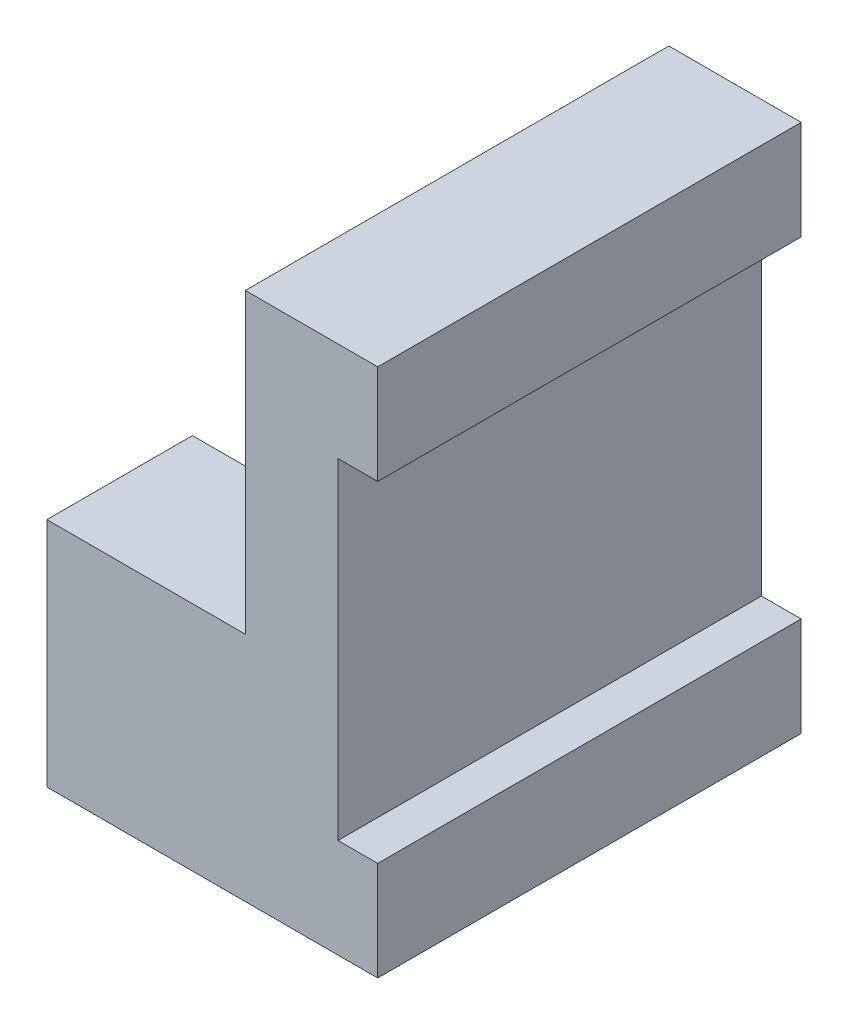
ISO-10303-21;
HEADER;
FILE_DESCRIPTION(('STEP AP214'),'2;1');
FILE_NAME('part.step','',(''),(''),'','','');
FILE_SCHEMA(('AUTOMOTIVE_DESIGN { 1 0 10303 214 1 1 1 1 }'));
ENDSEC;
DATA;
#1=APPLICATION_CONTEXT('core data for automotive mechanical design processes');
#2=APPLICATION_PROTOCOL_DEFINITION('international standard','automotive_design',2000,#1);
#3=PRODUCT_CONTEXT('',#1,'mechanical');
#4=PRODUCT('Part','Part','',(#3));
#5=PRODUCT_RELATED_PRODUCT_CATEGORY('part','',(#4));
#6=PRODUCT_DEFINITION_FORMATION('','',#4);
#7=PRODUCT_DEFINITION_CONTEXT('part definition',#1,'design');
#8=PRODUCT_DEFINITION('design','',#6,#7);
#9=PRODUCT_DEFINITION_SHAPE('','',#8);
#10=(LENGTH_UNIT() NAMED_UNIT(*) SI_UNIT(.MILLI.,.METRE.));
#11=(NAMED_UNIT(*) PLANE_ANGLE_UNIT() SI_UNIT($,.RADIAN.));
#12=(NAMED_UNIT(*) SI_UNIT($,.STERADIAN.) SOLID_ANGLE_UNIT());
#13=UNCERTAINTY_MEASURE_WITH_UNIT(LENGTH_MEASURE(1.E-05),#10,'distance_accuracy_value','');
#14=(GEOMETRIC_REPRESENTATION_CONTEXT(3) GLOBAL_UNCERTAINTY_ASSIGNED_CONTEXT((#13)) GLOBAL_UNIT_ASSIGNED_CONTEXT((#10,
#11,#12)) REPRESENTATION_CONTEXT('',''));
#15=CARTESIAN_POINT('',(0.,0.,0.));
#16=DIRECTION('',(0.,0.,1.));
#17=DIRECTION('',(1.,0.,0.));
#18=AXIS2_PLACEMENT_3D('',#15,#16,#17);
#19=CARTESIAN_POINT('',(0.,0.,64.));
#20=DIRECTION('',(1.,0.,0.));
#21=DIRECTION('',(0.,0.,-1.));
#22=AXIS2_PLACEMENT_3D('',#19,#20,#21);
#23=PLANE('',#22);
#24=DIRECTION('',(0.,0.,-1.));
#25=VECTOR('',#24,1.);
#26=CARTESIAN_POINT('',(0.,0.,64.));
#27=LINE('',#26,#25);
#28=CARTESIAN_POINT('',(0.,0.,22.));
#29=VERTEX_POINT('',#28);
#30=CARTESIAN_POINT('',(0.,0.,0.));
#31=VERTEX_POINT('',#30);
#32=EDGE_CURVE('E48',#29,#31,#27,.T.);
#33=ORIENTED_EDGE('',*,*,#32,.F.);
#34=DIRECTION('',(0.,-1.,0.));
#35=VECTOR('',#34,1.);
#36=CARTESIAN_POINT('',(0.,0.,22.));
#37=LINE('',#36,#35);
#38=CARTESIAN_POINT('',(0.,35.,22.));
#39=VERTEX_POINT('',#38);
#40=EDGE_CURVE('E328',#39,#29,#37,.T.);
#41=ORIENTED_EDGE('',*,*,#40,.F.);
#42=DIRECTION('',(0.,0.,-1.));
#43=VECTOR('',#42,1.);
#44=CARTESIAN_POINT('',(0.,35.,64.));
#45=LINE('',#44,#43);
#46=CARTESIAN_POINT('',(0.,35.,0.));
#47=VERTEX_POINT('',#46);
#48=EDGE_CURVE('E104',#39,#47,#45,.T.);
#49=ORIENTED_EDGE('',*,*,#48,.T.);
#50=DIRECTION('',(0.,-1.,0.));
#51=VECTOR('',#50,1.);
#52=CARTESIAN_POINT('',(0.,0.,0.));
#53=LINE('',#52,#51);
#54=EDGE_CURVE('E166',#47,#31,#53,.T.);
#55=ORIENTED_EDGE('',*,*,#54,.T.);
#56=EDGE_LOOP('',(#33,#41,#49,#55));
#57=FACE_BOUND('',#56,.T.);
#58=ADVANCED_FACE('F39',(#57),#23,.F.);
#59=CARTESIAN_POINT('',(0.,35.,64.));
#60=VERTEX_POINT('',#59);
#61=CARTESIAN_POINT('',(0.,35.,42.));
#62=VERTEX_POINT('',#61);
#63=EDGE_CURVE('E197',#60,#62,#45,.T.);
#64=ORIENTED_EDGE('',*,*,#63,.T.);
#65=DIRECTION('',(0.,1.,0.));
#66=VECTOR('',#65,1.);
#67=CARTESIAN_POINT('',(0.,0.,42.));
#68=LINE('',#67,#66);
#69=CARTESIAN_POINT('',(0.,0.,42.));
#70=VERTEX_POINT('',#69);
#71=EDGE_CURVE('E255',#70,#62,#68,.T.);
#72=ORIENTED_EDGE('',*,*,#71,.F.);
#73=CARTESIAN_POINT('',(0.,0.,64.));
#74=VERTEX_POINT('',#73);
#75=EDGE_CURVE('E11',#74,#70,#27,.T.);
#76=ORIENTED_EDGE('',*,*,#75,.F.);
#77=DIRECTION('',(0.,-1.,0.));
#78=VECTOR('',#77,1.);
#79=CARTESIAN_POINT('',(0.,0.,64.));
#80=LINE('',#79,#78);
#81=EDGE_CURVE('E196',#60,#74,#80,.T.);
#82=ORIENTED_EDGE('',*,*,#81,.F.);
#83=EDGE_LOOP('',(#64,#72,#76,#82));
#84=FACE_BOUND('',#83,.T.);
#85=ADVANCED_FACE('F41',(#84),#23,.F.);
#86=CARTESIAN_POINT('',(0.,0.,64.));
#87=DIRECTION('',(0.,1.,0.));
#88=DIRECTION('',(0.,0.,1.));
#89=AXIS2_PLACEMENT_3D('',#86,#87,#88);
#90=PLANE('',#89);
#91=DIRECTION('',(0.,0.,1.));
#92=VECTOR('',#91,1.);
#93=CARTESIAN_POINT('',(22.,0.,22.));
#94=LINE('',#93,#92);
#95=CARTESIAN_POINT('',(22.,0.,22.));
#96=VERTEX_POINT('',#95);
#97=CARTESIAN_POINT('',(22.,0.,42.));
#98=VERTEX_POINT('',#97);
#99=EDGE_CURVE('E317',#96,#98,#94,.T.);
#100=ORIENTED_EDGE('',*,*,#99,.F.);
#101=DIRECTION('',(-1.,0.,0.));
#102=VECTOR('',#101,1.);
#103=CARTESIAN_POINT('',(22.,0.,22.));
#104=LINE('',#103,#102);
#105=EDGE_CURVE('E234',#96,#29,#104,.T.);
#106=ORIENTED_EDGE('',*,*,#105,.T.);
#107=ORIENTED_EDGE('',*,*,#32,.T.);
#108=DIRECTION('',(1.,0.,0.));
#109=VECTOR('',#108,1.);
#110=CARTESIAN_POINT('',(0.,0.,0.));
#111=LINE('',#110,#109);
#112=CARTESIAN_POINT('',(50.,0.,0.));
#113=VERTEX_POINT('',#112);
#114=EDGE_CURVE('E169',#31,#113,#111,.T.);
#115=ORIENTED_EDGE('',*,*,#114,.T.);
#116=DIRECTION('',(0.,0.,-1.));
#117=VECTOR('',#116,1.);
#118=CARTESIAN_POINT('',(50.,0.,64.));
#119=LINE('',#118,#117);
#120=CARTESIAN_POINT('',(50.,0.,64.));
#121=VERTEX_POINT('',#120);
#122=EDGE_CURVE('E220',#121,#113,#119,.T.);
#123=ORIENTED_EDGE('',*,*,#122,.F.);
#124=DIRECTION('',(1.,0.,0.));
#125=VECTOR('',#124,1.);
#126=CARTESIAN_POINT('',(0.,0.,64.));
#127=LINE('',#126,#125);
#128=EDGE_CURVE('E112',#74,#121,#127,.T.);
#129=ORIENTED_EDGE('',*,*,#128,.F.);
#130=ORIENTED_EDGE('',*,*,#75,.T.);
#131=DIRECTION('',(-1.,0.,0.));
#132=VECTOR('',#131,1.);
#133=CARTESIAN_POINT('',(22.,0.,42.));
#134=LINE('',#133,#132);
#135=EDGE_CURVE('E265',#98,#70,#134,.T.);
#136=ORIENTED_EDGE('',*,*,#135,.F.);
#137=EDGE_LOOP('',(#100,#106,#107,#115,#123,#129,#130,#136));
#138=FACE_BOUND('',#137,.T.);
#139=ADVANCED_FACE('F231',(#138),#90,.F.);
#140=CARTESIAN_POINT('',(50.,15.,64.));
#141=DIRECTION('',(-1.,0.,0.));
#142=DIRECTION('',(0.,0.,1.));
#143=AXIS2_PLACEMENT_3D('',#140,#141,#142);
#144=PLANE('',#143);
#145=DIRECTION('',(0.,1.,0.));
#146=VECTOR('',#145,1.);
#147=CARTESIAN_POINT('',(50.,15.,0.));
#148=LINE('',#147,#146);
#149=CARTESIAN_POINT('',(50.,15.,0.));
#150=VERTEX_POINT('',#149);
#151=EDGE_CURVE('E173',#113,#150,#148,.T.);
#152=ORIENTED_EDGE('',*,*,#151,.T.);
#153=DIRECTION('',(0.,0.,-1.));
#154=VECTOR('',#153,1.);
#155=CARTESIAN_POINT('',(50.,15.,64.));
#156=LINE('',#155,#154);
#157=CARTESIAN_POINT('',(50.,15.,64.));
#158=VERTEX_POINT('',#157);
#159=EDGE_CURVE('E217',#158,#150,#156,.T.);
#160=ORIENTED_EDGE('',*,*,#159,.F.);
#161=DIRECTION('',(0.,1.,0.));
#162=VECTOR('',#161,1.);
#163=CARTESIAN_POINT('',(50.,15.,64.));
#164=LINE('',#163,#162);
#165=EDGE_CURVE('E281',#121,#158,#164,.T.);
#166=ORIENTED_EDGE('',*,*,#165,.F.);
#167=ORIENTED_EDGE('',*,*,#122,.T.);
#168=EDGE_LOOP('',(#152,#160,#166,#167));
#169=FACE_BOUND('',#168,.T.);
#170=ADVANCED_FACE('F248',(#169),#144,.F.);
#171=CARTESIAN_POINT('',(44.,15.,64.));
#172=DIRECTION('',(0.,-1.,0.));
#173=DIRECTION('',(0.,0.,-1.));
#174=AXIS2_PLACEMENT_3D('',#171,#172,#173);
#175=PLANE('',#174);
#176=DIRECTION('',(-1.,0.,0.));
#177=VECTOR('',#176,1.);
#178=CARTESIAN_POINT('',(44.,15.,0.));
#179=LINE('',#178,#177);
#180=CARTESIAN_POINT('',(44.,15.,0.));
#181=VERTEX_POINT('',#180);
#182=EDGE_CURVE('E176',#150,#181,#179,.T.);
#183=ORIENTED_EDGE('',*,*,#182,.T.);
#184=DIRECTION('',(0.,0.,-1.));
#185=VECTOR('',#184,1.);
#186=CARTESIAN_POINT('',(44.,15.,64.));
#187=LINE('',#186,#185);
#188=CARTESIAN_POINT('',(44.,15.,64.));
#189=VERTEX_POINT('',#188);
#190=EDGE_CURVE('E213',#189,#181,#187,.T.);
#191=ORIENTED_EDGE('',*,*,#190,.F.);
#192=DIRECTION('',(-1.,0.,0.));
#193=VECTOR('',#192,1.);
#194=CARTESIAN_POINT('',(44.,15.,64.));
#195=LINE('',#194,#193);
#196=EDGE_CURVE('E284',#158,#189,#195,.T.);
#197=ORIENTED_EDGE('',*,*,#196,.F.);
#198=ORIENTED_EDGE('',*,*,#159,.T.);
#199=EDGE_LOOP('',(#183,#191,#197,#198));
#200=FACE_BOUND('',#199,.T.);
#201=ADVANCED_FACE('F358',(#200),#175,.F.);
#202=CARTESIAN_POINT('',(44.,65.,64.));
#203=DIRECTION('',(-1.,0.,0.));
#204=DIRECTION('',(0.,0.,1.));
#205=AXIS2_PLACEMENT_3D('',#202,#203,#204);
#206=PLANE('',#205);
#207=DIRECTION('',(0.,1.,0.));
#208=VECTOR('',#207,1.);
#209=CARTESIAN_POINT('',(44.,65.,0.));
#210=LINE('',#209,#208);
#211=CARTESIAN_POINT('',(44.,65.,0.));
#212=VERTEX_POINT('',#211);
#213=EDGE_CURVE('E179',#181,#212,#210,.T.);
#214=ORIENTED_EDGE('',*,*,#213,.T.);
#215=DIRECTION('',(0.,0.,-1.));
#216=VECTOR('',#215,1.);
#217=CARTESIAN_POINT('',(44.,65.,64.));
#218=LINE('',#217,#216);
#219=CARTESIAN_POINT('',(44.,65.,64.));
#220=VERTEX_POINT('',#219);
#221=EDGE_CURVE('E209',#220,#212,#218,.T.);
#222=ORIENTED_EDGE('',*,*,#221,.F.);
#223=DIRECTION('',(0.,1.,0.));
#224=VECTOR('',#223,1.);
#225=CARTESIAN_POINT('',(44.,65.,64.));
#226=LINE('',#225,#224);
#227=EDGE_CURVE('E287',#189,#220,#226,.T.);
#228=ORIENTED_EDGE('',*,*,#227,.F.);
#229=ORIENTED_EDGE('',*,*,#190,.T.);
#230=EDGE_LOOP('',(#214,#222,#228,#229));
#231=FACE_BOUND('',#230,.T.);
#232=ADVANCED_FACE('F355',(#231),#206,.F.);
#233=CARTESIAN_POINT('',(50.,65.,64.));
#234=DIRECTION('',(0.,1.,0.));
#235=DIRECTION('',(0.,0.,1.));
#236=AXIS2_PLACEMENT_3D('',#233,#234,#235);
#237=PLANE('',#236);
#238=DIRECTION('',(1.,0.,0.));
#239=VECTOR('',#238,1.);
#240=CARTESIAN_POINT('',(50.,65.,0.));
#241=LINE('',#240,#239);
#242=CARTESIAN_POINT('',(50.,65.,0.));
#243=VERTEX_POINT('',#242);
#244=EDGE_CURVE('E182',#212,#243,#241,.T.);
#245=ORIENTED_EDGE('',*,*,#244,.T.);
#246=DIRECTION('',(0.,0.,-1.));
#247=VECTOR('',#246,1.);
#248=CARTESIAN_POINT('',(50.,65.,64.));
#249=LINE('',#248,#247);
#250=CARTESIAN_POINT('',(50.,65.,64.));
#251=VERTEX_POINT('',#250);
#252=EDGE_CURVE('E205',#251,#243,#249,.T.);
#253=ORIENTED_EDGE('',*,*,#252,.F.);
#254=DIRECTION('',(1.,0.,0.));
#255=VECTOR('',#254,1.);
#256=CARTESIAN_POINT('',(50.,65.,64.));
#257=LINE('',#256,#255);
#258=EDGE_CURVE('E290',#220,#251,#257,.T.);
#259=ORIENTED_EDGE('',*,*,#258,.F.);
#260=ORIENTED_EDGE('',*,*,#221,.T.);
#261=EDGE_LOOP('',(#245,#253,#259,#260));
#262=FACE_BOUND('',#261,.T.);
#263=ADVANCED_FACE('F298',(#262),#237,.F.);
#264=CARTESIAN_POINT('',(50.,80.,64.));
#265=DIRECTION('',(-1.,0.,0.));
#266=DIRECTION('',(0.,0.,1.));
#267=AXIS2_PLACEMENT_3D('',#264,#265,#266);
#268=PLANE('',#267);
#269=DIRECTION('',(0.,1.,0.));
#270=VECTOR('',#269,1.);
#271=CARTESIAN_POINT('',(50.,80.,0.));
#272=LINE('',#271,#270);
#273=CARTESIAN_POINT('',(50.,80.,0.));
#274=VERTEX_POINT('',#273);
#275=EDGE_CURVE('E185',#243,#274,#272,.T.);
#276=ORIENTED_EDGE('',*,*,#275,.T.);
#277=DIRECTION('',(0.,0.,-1.));
#278=VECTOR('',#277,1.);
#279=CARTESIAN_POINT('',(50.,80.,64.));
#280=LINE('',#279,#278);
#281=CARTESIAN_POINT('',(50.,80.,64.));
#282=VERTEX_POINT('',#281);
#283=EDGE_CURVE('E155',#282,#274,#280,.T.);
#284=ORIENTED_EDGE('',*,*,#283,.F.);
#285=DIRECTION('',(0.,1.,0.));
#286=VECTOR('',#285,1.);
#287=CARTESIAN_POINT('',(50.,80.,64.));
#288=LINE('',#287,#286);
#289=EDGE_CURVE('E141',#251,#282,#288,.T.);
#290=ORIENTED_EDGE('',*,*,#289,.F.);
#291=ORIENTED_EDGE('',*,*,#252,.T.);
#292=EDGE_LOOP('',(#276,#284,#290,#291));
#293=FACE_BOUND('',#292,.T.);
#294=ADVANCED_FACE('F302',(#293),#268,.F.);
#295=CARTESIAN_POINT('',(30.,80.,64.));
#296=DIRECTION('',(0.,-1.,0.));
#297=DIRECTION('',(0.,0.,-1.));
#298=AXIS2_PLACEMENT_3D('',#295,#296,#297);
#299=PLANE('',#298);
#300=DIRECTION('',(-1.,0.,0.));
#301=VECTOR('',#300,1.);
#302=CARTESIAN_POINT('',(30.,80.,0.));
#303=LINE('',#302,#301);
#304=CARTESIAN_POINT('',(30.,80.,0.));
#305=VERTEX_POINT('',#304);
#306=EDGE_CURVE('E151',#274,#305,#303,.T.);
#307=ORIENTED_EDGE('',*,*,#306,.T.);
#308=DIRECTION('',(0.,0.,-1.));
#309=VECTOR('',#308,1.);
#310=CARTESIAN_POINT('',(30.,80.,64.));
#311=LINE('',#310,#309);
#312=CARTESIAN_POINT('',(30.,80.,64.));
#313=VERTEX_POINT('',#312);
#314=EDGE_CURVE('E148',#313,#305,#311,.T.);
#315=ORIENTED_EDGE('',*,*,#314,.F.);
#316=DIRECTION('',(-1.,0.,0.));
#317=VECTOR('',#316,1.);
#318=CARTESIAN_POINT('',(30.,80.,64.));
#319=LINE('',#318,#317);
#320=EDGE_CURVE('E134',#282,#313,#319,.T.);
#321=ORIENTED_EDGE('',*,*,#320,.F.);
#322=ORIENTED_EDGE('',*,*,#283,.T.);
#323=EDGE_LOOP('',(#307,#315,#321,#322));
#324=FACE_BOUND('',#323,.T.);
#325=ADVANCED_FACE('F149',(#324),#299,.F.);
#326=CARTESIAN_POINT('',(30.,35.,64.));
#327=DIRECTION('',(1.,0.,0.));
#328=DIRECTION('',(0.,0.,-1.));
#329=AXIS2_PLACEMENT_3D('',#326,#327,#328);
#330=PLANE('',#329);
#331=DIRECTION('',(0.,-1.,0.));
#332=VECTOR('',#331,1.);
#333=CARTESIAN_POINT('',(30.,35.,0.));
#334=LINE('',#333,#332);
#335=CARTESIAN_POINT('',(30.,35.,0.));
#336=VERTEX_POINT('',#335);
#337=EDGE_CURVE('E190',#305,#336,#334,.T.);
#338=ORIENTED_EDGE('',*,*,#337,.T.);
#339=DIRECTION('',(0.,0.,-1.));
#340=VECTOR('',#339,1.);
#341=CARTESIAN_POINT('',(30.,35.,64.));
#342=LINE('',#341,#340);
#343=CARTESIAN_POINT('',(30.,35.,64.));
#344=VERTEX_POINT('',#343);
#345=EDGE_CURVE('E156',#344,#336,#342,.T.);
#346=ORIENTED_EDGE('',*,*,#345,.F.);
#347=DIRECTION('',(0.,-1.,0.));
#348=VECTOR('',#347,1.);
#349=CARTESIAN_POINT('',(30.,35.,64.));
#350=LINE('',#349,#348);
#351=EDGE_CURVE('E138',#313,#344,#350,.T.);
#352=ORIENTED_EDGE('',*,*,#351,.F.);
#353=ORIENTED_EDGE('',*,*,#314,.T.);
#354=EDGE_LOOP('',(#338,#346,#352,#353));
#355=FACE_BOUND('',#354,.T.);
#356=ADVANCED_FACE('F158',(#355),#330,.F.);
#357=CARTESIAN_POINT('',(0.,35.,64.));
#358=DIRECTION('',(0.,-1.,0.));
#359=DIRECTION('',(0.,0.,-1.));
#360=AXIS2_PLACEMENT_3D('',#357,#358,#359);
#361=PLANE('',#360);
#362=ORIENTED_EDGE('',*,*,#48,.F.);
#363=DIRECTION('',(-1.,0.,0.));
#364=VECTOR('',#363,1.);
#365=CARTESIAN_POINT('',(22.,35.,22.));
#366=LINE('',#365,#364);
#367=CARTESIAN_POINT('',(22.,35.,22.));
#368=VERTEX_POINT('',#367);
#369=EDGE_CURVE('E170',#368,#39,#366,.T.);
#370=ORIENTED_EDGE('',*,*,#369,.F.);
#371=DIRECTION('',(0.,0.,-1.));
#372=VECTOR('',#371,1.);
#373=CARTESIAN_POINT('',(22.,35.,22.));
#374=LINE('',#373,#372);
#375=CARTESIAN_POINT('',(22.,35.,42.));
#376=VERTEX_POINT('',#375);
#377=EDGE_CURVE('E262',#376,#368,#374,.T.);
#378=ORIENTED_EDGE('',*,*,#377,.F.);
#379=DIRECTION('',(-1.,0.,0.));
#380=VECTOR('',#379,1.);
#381=CARTESIAN_POINT('',(22.,35.,42.));
#382=LINE('',#381,#380);
#383=EDGE_CURVE('E260',#376,#62,#382,.T.);
#384=ORIENTED_EDGE('',*,*,#383,.T.);
#385=ORIENTED_EDGE('',*,*,#63,.F.);
#386=DIRECTION('',(-1.,0.,0.));
#387=VECTOR('',#386,1.);
#388=CARTESIAN_POINT('',(0.,35.,64.));
#389=LINE('',#388,#387);
#390=EDGE_CURVE('E64',#344,#60,#389,.T.);
#391=ORIENTED_EDGE('',*,*,#390,.F.);
#392=ORIENTED_EDGE('',*,*,#345,.T.);
#393=DIRECTION('',(-1.,0.,0.));
#394=VECTOR('',#393,1.);
#395=CARTESIAN_POINT('',(0.,35.,0.));
#396=LINE('',#395,#394);
#397=EDGE_CURVE('E193',#336,#47,#396,.T.);
#398=ORIENTED_EDGE('',*,*,#397,.T.);
#399=EDGE_LOOP('',(#362,#370,#378,#384,#385,#391,#392,#398));
#400=FACE_BOUND('',#399,.T.);
#401=ADVANCED_FACE('F258',(#400),#361,.F.);
#402=CARTESIAN_POINT('',(0.,0.,64.));
#403=DIRECTION('',(0.,0.,-1.));
#404=DIRECTION('',(-1.,0.,0.));
#405=AXIS2_PLACEMENT_3D('',#402,#403,#404);
#406=PLANE('',#405);
#407=ORIENTED_EDGE('',*,*,#81,.T.);
#408=ORIENTED_EDGE('',*,*,#128,.T.);
#409=ORIENTED_EDGE('',*,*,#165,.T.);
#410=ORIENTED_EDGE('',*,*,#196,.T.);
#411=ORIENTED_EDGE('',*,*,#227,.T.);
#412=ORIENTED_EDGE('',*,*,#258,.T.);
#413=ORIENTED_EDGE('',*,*,#289,.T.);
#414=ORIENTED_EDGE('',*,*,#320,.T.);
#415=ORIENTED_EDGE('',*,*,#351,.T.);
#416=ORIENTED_EDGE('',*,*,#390,.T.);
#417=EDGE_LOOP('',(#407,#408,#409,#410,#411,#412,#413,#414,#415,#416));
#418=FACE_BOUND('',#417,.T.);
#419=ADVANCED_FACE('F136',(#418),#406,.F.);
#420=CARTESIAN_POINT('',(0.,0.,0.));
#421=DIRECTION('',(0.,0.,-1.));
#422=DIRECTION('',(-1.,0.,0.));
#423=AXIS2_PLACEMENT_3D('',#420,#421,#422);
#424=PLANE('',#423);
#425=ORIENTED_EDGE('',*,*,#54,.F.);
#426=ORIENTED_EDGE('',*,*,#397,.F.);
#427=ORIENTED_EDGE('',*,*,#337,.F.);
#428=ORIENTED_EDGE('',*,*,#306,.F.);
#429=ORIENTED_EDGE('',*,*,#275,.F.);
#430=ORIENTED_EDGE('',*,*,#244,.F.);
#431=ORIENTED_EDGE('',*,*,#213,.F.);
#432=ORIENTED_EDGE('',*,*,#182,.F.);
#433=ORIENTED_EDGE('',*,*,#151,.F.);
#434=ORIENTED_EDGE('',*,*,#114,.F.);
#435=EDGE_LOOP('',(#425,#426,#427,#428,#429,#430,#431,#432,#433,#434));
#436=FACE_BOUND('',#435,.T.);
#437=ADVANCED_FACE('F237',(#436),#424,.T.);
#438=CARTESIAN_POINT('',(22.,0.,22.));
#439=DIRECTION('',(0.,0.,-1.));
#440=DIRECTION('',(-1.,0.,0.));
#441=AXIS2_PLACEMENT_3D('',#438,#439,#440);
#442=PLANE('',#441);
#443=ORIENTED_EDGE('',*,*,#40,.T.);
#444=ORIENTED_EDGE('',*,*,#105,.F.);
#445=DIRECTION('',(0.,-1.,0.));
#446=VECTOR('',#445,1.);
#447=CARTESIAN_POINT('',(22.,0.,22.));
#448=LINE('',#447,#446);
#449=EDGE_CURVE('E319',#368,#96,#448,.T.);
#450=ORIENTED_EDGE('',*,*,#449,.F.);
#451=ORIENTED_EDGE('',*,*,#369,.T.);
#452=EDGE_LOOP('',(#443,#444,#450,#451));
#453=FACE_BOUND('',#452,.T.);
#454=ADVANCED_FACE('F331',(#453),#442,.F.);
#455=CARTESIAN_POINT('',(22.,0.,42.));
#456=DIRECTION('',(0.,0.,1.));
#457=DIRECTION('',(1.,0.,0.));
#458=AXIS2_PLACEMENT_3D('',#455,#456,#457);
#459=PLANE('',#458);
#460=ORIENTED_EDGE('',*,*,#71,.T.);
#461=ORIENTED_EDGE('',*,*,#383,.F.);
#462=DIRECTION('',(0.,1.,0.));
#463=VECTOR('',#462,1.);
#464=CARTESIAN_POINT('',(22.,0.,42.));
#465=LINE('',#464,#463);
#466=EDGE_CURVE('E55',#98,#376,#465,.T.);
#467=ORIENTED_EDGE('',*,*,#466,.F.);
#468=ORIENTED_EDGE('',*,*,#135,.T.);
#469=EDGE_LOOP('',(#460,#461,#467,#468));
#470=FACE_BOUND('',#469,.T.);
#471=ADVANCED_FACE('F316',(#470),#459,.F.);
#472=CARTESIAN_POINT('',(22.,0.,0.));
#473=DIRECTION('',(1.,0.,0.));
#474=DIRECTION('',(0.,0.,-1.));
#475=AXIS2_PLACEMENT_3D('',#472,#473,#474);
#476=PLANE('',#475);
#477=ORIENTED_EDGE('',*,*,#449,.T.);
#478=ORIENTED_EDGE('',*,*,#99,.T.);
#479=ORIENTED_EDGE('',*,*,#466,.T.);
#480=ORIENTED_EDGE('',*,*,#377,.T.);
#481=EDGE_LOOP('',(#477,#478,#479,#480));
#482=FACE_BOUND('',#481,.T.);
#483=ADVANCED_FACE('F338',(#482),#476,.F.);
#484=CLOSED_SHELL('',(#58,#85,#139,#170,#201,#232,#263,#294,#325,#356,#401,#419,#437,#454,#471,#483));
#485=MANIFOLD_SOLID_BREP('B2',#484);
#486=ADVANCED_BREP_SHAPE_REPRESENTATION('',(#18,#485),#14);
#487=SHAPE_DEFINITION_REPRESENTATION(#9,#486);
ENDSEC;
END-ISO-10303-21;
